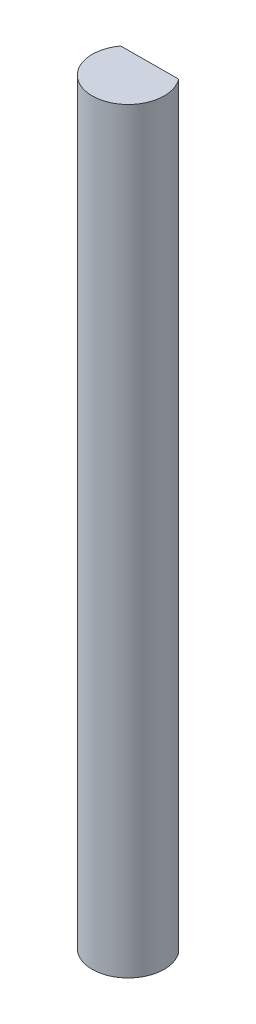
ISO-10303-21;
HEADER;
FILE_DESCRIPTION(('STEP AP214'),'2;1');
FILE_NAME('part.step','',(''),(''),'','','');
FILE_SCHEMA(('AUTOMOTIVE_DESIGN { 1 0 10303 214 1 1 1 1 }'));
ENDSEC;
DATA;
#1=APPLICATION_CONTEXT('core data for automotive mechanical design processes');
#2=APPLICATION_PROTOCOL_DEFINITION('international standard','automotive_design',2000,#1);
#3=PRODUCT_CONTEXT('',#1,'mechanical');
#4=PRODUCT('Part','Part','',(#3));
#5=PRODUCT_RELATED_PRODUCT_CATEGORY('part','',(#4));
#6=PRODUCT_DEFINITION_FORMATION('','',#4);
#7=PRODUCT_DEFINITION_CONTEXT('part definition',#1,'design');
#8=PRODUCT_DEFINITION('design','',#6,#7);
#9=PRODUCT_DEFINITION_SHAPE('','',#8);
#10=(LENGTH_UNIT() NAMED_UNIT(*) SI_UNIT(.MILLI.,.METRE.));
#11=(NAMED_UNIT(*) PLANE_ANGLE_UNIT() SI_UNIT($,.RADIAN.));
#12=(NAMED_UNIT(*) SI_UNIT($,.STERADIAN.) SOLID_ANGLE_UNIT());
#13=UNCERTAINTY_MEASURE_WITH_UNIT(LENGTH_MEASURE(1.E-05),#10,'distance_accuracy_value','');
#14=(GEOMETRIC_REPRESENTATION_CONTEXT(3) GLOBAL_UNCERTAINTY_ASSIGNED_CONTEXT((#13)) GLOBAL_UNIT_ASSIGNED_CONTEXT((#10,
#11,#12)) REPRESENTATION_CONTEXT('',''));
#15=CARTESIAN_POINT('',(0.,0.,0.));
#16=DIRECTION('',(0.,0.,1.));
#17=DIRECTION('',(1.,0.,0.));
#18=AXIS2_PLACEMENT_3D('',#15,#16,#17);
#19=CARTESIAN_POINT('',(0.,41.275,0.));
#20=DIRECTION('',(0.,-1.,0.));
#21=DIRECTION('',(0.,0.,-1.));
#22=AXIS2_PLACEMENT_3D('',#19,#20,#21);
#23=CYLINDRICAL_SURFACE('',#22,3.175);
#24=CARTESIAN_POINT('',(0.,25.4,0.));
#25=DIRECTION('',(0.,1.,0.));
#26=DIRECTION('',(0.,0.,1.));
#27=AXIS2_PLACEMENT_3D('',#24,#25,#26);
#28=CIRCLE('',#27,3.175);
#29=CARTESIAN_POINT('',(-2.54932246413979,25.4,-1.8925062678449));
#30=VERTEX_POINT('',#29);
#31=CARTESIAN_POINT('',(2.53067753586021,25.4,-1.91736699916643));
#32=VERTEX_POINT('',#31);
#33=EDGE_CURVE('E54',#30,#32,#28,.T.);
#34=ORIENTED_EDGE('',*,*,#33,.F.);
#35=DIRECTION('',(0.,1.,0.));
#36=VECTOR('',#35,1.);
#37=CARTESIAN_POINT('',(-2.54932246413979,-41.275,-1.8925062678449));
#38=LINE('',#37,#36);
#39=CARTESIAN_POINT('',(-2.54932246413979,-41.275,-1.8925062678449));
#40=VERTEX_POINT('',#39);
#41=EDGE_CURVE('E48',#40,#30,#38,.T.);
#42=ORIENTED_EDGE('',*,*,#41,.F.);
#43=CARTESIAN_POINT('',(0.,-41.275,0.));
#44=DIRECTION('',(0.,1.,0.));
#45=DIRECTION('',(0.,0.,1.));
#46=AXIS2_PLACEMENT_3D('',#43,#44,#45);
#47=CIRCLE('',#46,3.175);
#48=CARTESIAN_POINT('',(2.53067753586021,-41.275,-1.91736699916643));
#49=VERTEX_POINT('',#48);
#50=EDGE_CURVE('E11',#40,#49,#47,.T.);
#51=ORIENTED_EDGE('',*,*,#50,.T.);
#52=DIRECTION('',(0.,1.,0.));
#53=VECTOR('',#52,1.);
#54=CARTESIAN_POINT('',(2.53067753586021,-41.275,-1.91736699916643));
#55=LINE('',#54,#53);
#56=EDGE_CURVE('E62',#49,#32,#55,.T.);
#57=ORIENTED_EDGE('',*,*,#56,.T.);
#58=EDGE_LOOP('',(#34,#42,#51,#57));
#59=FACE_BOUND('',#58,.T.);
#60=ADVANCED_FACE('F40',(#59),#23,.T.);
#61=CARTESIAN_POINT('',(-2.54932246413979,-41.275,-1.8925062678449));
#62=DIRECTION('',(0.00489378614628873,0.,0.999988025356881));
#63=DIRECTION('',(0.999988025356881,0.,-0.00489378614628873));
#64=AXIS2_PLACEMENT_3D('',#61,#62,#63);
#65=PLANE('',#64);
#66=DIRECTION('',(-0.999988025356881,0.,0.00489378614628877));
#67=VECTOR('',#66,1.);
#68=CARTESIAN_POINT('',(2.53067753586021,25.4,-1.91736699916643));
#69=LINE('',#68,#67);
#70=EDGE_CURVE('E67',#32,#30,#69,.T.);
#71=ORIENTED_EDGE('',*,*,#70,.F.);
#72=ORIENTED_EDGE('',*,*,#56,.F.);
#73=DIRECTION('',(0.999988025356881,0.,-0.00489378614628873));
#74=VECTOR('',#73,1.);
#75=CARTESIAN_POINT('',(-2.54932246413979,-41.275,-1.8925062678449));
#76=LINE('',#75,#74);
#77=EDGE_CURVE('E70',#40,#49,#76,.T.);
#78=ORIENTED_EDGE('',*,*,#77,.F.);
#79=ORIENTED_EDGE('',*,*,#41,.T.);
#80=EDGE_LOOP('',(#71,#72,#78,#79));
#81=FACE_BOUND('',#80,.T.);
#82=ADVANCED_FACE('F76',(#81),#65,.F.);
#83=CARTESIAN_POINT('',(0.,-41.275,0.));
#84=DIRECTION('',(0.,1.,0.));
#85=DIRECTION('',(0.,0.,1.));
#86=AXIS2_PLACEMENT_3D('',#83,#84,#85);
#87=PLANE('',#86);
#88=ORIENTED_EDGE('',*,*,#50,.F.);
#89=ORIENTED_EDGE('',*,*,#77,.T.);
#90=EDGE_LOOP('',(#88,#89));
#91=FACE_BOUND('',#90,.T.);
#92=ADVANCED_FACE('F83',(#91),#87,.F.);
#93=CARTESIAN_POINT('',(0.,25.4,0.));
#94=DIRECTION('',(0.,1.,0.));
#95=DIRECTION('',(0.,0.,1.));
#96=AXIS2_PLACEMENT_3D('',#93,#94,#95);
#97=PLANE('',#96);
#98=ORIENTED_EDGE('',*,*,#33,.T.);
#99=ORIENTED_EDGE('',*,*,#70,.T.);
#100=EDGE_LOOP('',(#98,#99));
#101=FACE_BOUND('',#100,.T.);
#102=ADVANCED_FACE('F68',(#101),#97,.T.);
#103=CLOSED_SHELL('',(#60,#82,#92,#102));
#104=MANIFOLD_SOLID_BREP('B2',#103);
#105=ADVANCED_BREP_SHAPE_REPRESENTATION('',(#18,#104),#14);
#106=SHAPE_DEFINITION_REPRESENTATION(#9,#105);
ENDSEC;
END-ISO-10303-21;
